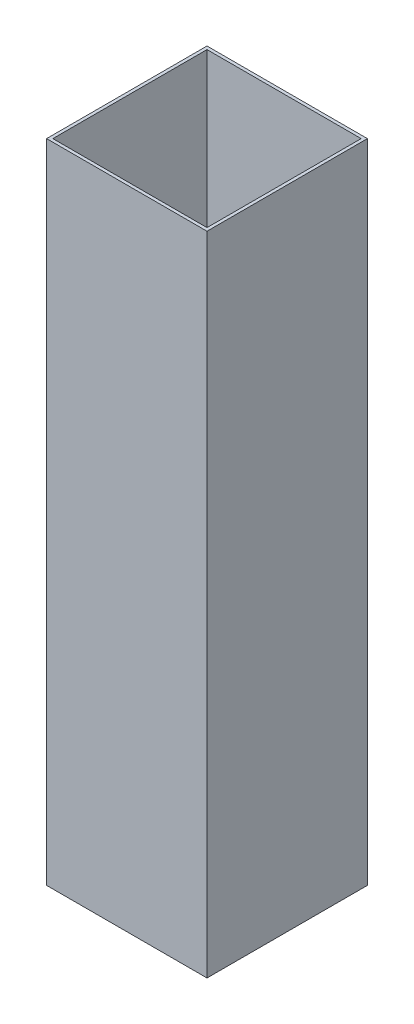
ISO-10303-21;
HEADER;
FILE_DESCRIPTION(('STEP AP214'),'2;1');
FILE_NAME('part.step','',(''),(''),'','','');
FILE_SCHEMA(('AUTOMOTIVE_DESIGN { 1 0 10303 214 1 1 1 1 }'));
ENDSEC;
DATA;
#1=APPLICATION_CONTEXT('core data for automotive mechanical design processes');
#2=APPLICATION_PROTOCOL_DEFINITION('international standard','automotive_design',2000,#1);
#3=PRODUCT_CONTEXT('',#1,'mechanical');
#4=PRODUCT('Part','Part','',(#3));
#5=PRODUCT_RELATED_PRODUCT_CATEGORY('part','',(#4));
#6=PRODUCT_DEFINITION_FORMATION('','',#4);
#7=PRODUCT_DEFINITION_CONTEXT('part definition',#1,'design');
#8=PRODUCT_DEFINITION('design','',#6,#7);
#9=PRODUCT_DEFINITION_SHAPE('','',#8);
#10=(LENGTH_UNIT() NAMED_UNIT(*) SI_UNIT(.MILLI.,.METRE.));
#11=(NAMED_UNIT(*) PLANE_ANGLE_UNIT() SI_UNIT($,.RADIAN.));
#12=(NAMED_UNIT(*) SI_UNIT($,.STERADIAN.) SOLID_ANGLE_UNIT());
#13=UNCERTAINTY_MEASURE_WITH_UNIT(LENGTH_MEASURE(1.E-05),#10,'distance_accuracy_value','');
#14=(GEOMETRIC_REPRESENTATION_CONTEXT(3) GLOBAL_UNCERTAINTY_ASSIGNED_CONTEXT((#13)) GLOBAL_UNIT_ASSIGNED_CONTEXT((#10,
#11,#12)) REPRESENTATION_CONTEXT('',''));
#15=CARTESIAN_POINT('',(0.,0.,0.));
#16=DIRECTION('',(0.,0.,1.));
#17=DIRECTION('',(1.,0.,0.));
#18=AXIS2_PLACEMENT_3D('',#15,#16,#17);
#19=CARTESIAN_POINT('',(-38.0354609929078,250.,-20.9964539007092));
#20=DIRECTION('',(1.,0.,0.));
#21=DIRECTION('',(0.,0.,-1.));
#22=AXIS2_PLACEMENT_3D('',#19,#20,#21);
#23=PLANE('',#22);
#24=DIRECTION('',(0.,0.,1.));
#25=VECTOR('',#24,1.);
#26=CARTESIAN_POINT('',(-38.0354609929078,0.,-20.9964539007092));
#27=LINE('',#26,#25);
#28=CARTESIAN_POINT('',(-38.0354609929078,0.,-20.9964539007092));
#29=VERTEX_POINT('',#28);
#30=CARTESIAN_POINT('',(-38.0354609929078,0.,41.0035460992908));
#31=VERTEX_POINT('',#30);
#32=EDGE_CURVE('E167',#29,#31,#27,.T.);
#33=ORIENTED_EDGE('',*,*,#32,.T.);
#34=DIRECTION('',(0.,-1.,0.));
#35=VECTOR('',#34,1.);
#36=CARTESIAN_POINT('',(-38.0354609929078,250.,41.0035460992908));
#37=LINE('',#36,#35);
#38=CARTESIAN_POINT('',(-38.0354609929078,250.,41.0035460992908));
#39=VERTEX_POINT('',#38);
#40=EDGE_CURVE('E11',#39,#31,#37,.T.);
#41=ORIENTED_EDGE('',*,*,#40,.F.);
#42=DIRECTION('',(0.,0.,1.));
#43=VECTOR('',#42,1.);
#44=CARTESIAN_POINT('',(-38.0354609929078,250.,-20.9964539007092));
#45=LINE('',#44,#43);
#46=CARTESIAN_POINT('',(-38.0354609929078,250.,-20.9964539007092));
#47=VERTEX_POINT('',#46);
#48=EDGE_CURVE('E156',#47,#39,#45,.T.);
#49=ORIENTED_EDGE('',*,*,#48,.F.);
#50=DIRECTION('',(0.,-1.,0.));
#51=VECTOR('',#50,1.);
#52=CARTESIAN_POINT('',(-38.0354609929078,250.,-20.9964539007092));
#53=LINE('',#52,#51);
#54=EDGE_CURVE('E166',#47,#29,#53,.T.);
#55=ORIENTED_EDGE('',*,*,#54,.T.);
#56=EDGE_LOOP('',(#33,#41,#49,#55));
#57=FACE_BOUND('',#56,.T.);
#58=ADVANCED_FACE('F39',(#57),#23,.F.);
#59=CARTESIAN_POINT('',(-38.0354609929078,250.,41.0035460992908));
#60=DIRECTION('',(0.,0.,-1.));
#61=DIRECTION('',(-1.,0.,0.));
#62=AXIS2_PLACEMENT_3D('',#59,#60,#61);
#63=PLANE('',#62);
#64=DIRECTION('',(1.,0.,0.));
#65=VECTOR('',#64,1.);
#66=CARTESIAN_POINT('',(-38.0354609929078,0.,41.0035460992908));
#67=LINE('',#66,#65);
#68=CARTESIAN_POINT('',(23.9645390070922,0.,41.0035460992908));
#69=VERTEX_POINT('',#68);
#70=EDGE_CURVE('E171',#31,#69,#67,.T.);
#71=ORIENTED_EDGE('',*,*,#70,.T.);
#72=DIRECTION('',(0.,-1.,0.));
#73=VECTOR('',#72,1.);
#74=CARTESIAN_POINT('',(23.9645390070922,250.,41.0035460992908));
#75=LINE('',#74,#73);
#76=CARTESIAN_POINT('',(23.9645390070922,250.,41.0035460992908));
#77=VERTEX_POINT('',#76);
#78=EDGE_CURVE('E47',#77,#69,#75,.T.);
#79=ORIENTED_EDGE('',*,*,#78,.F.);
#80=DIRECTION('',(1.,0.,0.));
#81=VECTOR('',#80,1.);
#82=CARTESIAN_POINT('',(-38.0354609929078,250.,41.0035460992908));
#83=LINE('',#82,#81);
#84=EDGE_CURVE('E91',#39,#77,#83,.T.);
#85=ORIENTED_EDGE('',*,*,#84,.F.);
#86=ORIENTED_EDGE('',*,*,#40,.T.);
#87=EDGE_LOOP('',(#71,#79,#85,#86));
#88=FACE_BOUND('',#87,.T.);
#89=ADVANCED_FACE('F206',(#88),#63,.F.);
#90=CARTESIAN_POINT('',(23.9645390070922,250.,-20.9964539007092));
#91=DIRECTION('',(-1.,0.,0.));
#92=DIRECTION('',(0.,0.,1.));
#93=AXIS2_PLACEMENT_3D('',#90,#91,#92);
#94=PLANE('',#93);
#95=DIRECTION('',(0.,0.,-1.));
#96=VECTOR('',#95,1.);
#97=CARTESIAN_POINT('',(23.9645390070922,0.,-20.9964539007092));
#98=LINE('',#97,#96);
#99=CARTESIAN_POINT('',(23.9645390070922,0.,-20.9964539007092));
#100=VERTEX_POINT('',#99);
#101=EDGE_CURVE('E174',#69,#100,#98,.T.);
#102=ORIENTED_EDGE('',*,*,#101,.T.);
#103=DIRECTION('',(0.,-1.,0.));
#104=VECTOR('',#103,1.);
#105=CARTESIAN_POINT('',(23.9645390070922,250.,-20.9964539007092));
#106=LINE('',#105,#104);
#107=CARTESIAN_POINT('',(23.9645390070922,250.,-20.9964539007092));
#108=VERTEX_POINT('',#107);
#109=EDGE_CURVE('E181',#108,#100,#106,.T.);
#110=ORIENTED_EDGE('',*,*,#109,.F.);
#111=DIRECTION('',(0.,0.,-1.));
#112=VECTOR('',#111,1.);
#113=CARTESIAN_POINT('',(23.9645390070922,250.,-20.9964539007092));
#114=LINE('',#113,#112);
#115=EDGE_CURVE('E161',#77,#108,#114,.T.);
#116=ORIENTED_EDGE('',*,*,#115,.F.);
#117=ORIENTED_EDGE('',*,*,#78,.T.);
#118=EDGE_LOOP('',(#102,#110,#116,#117));
#119=FACE_BOUND('',#118,.T.);
#120=ADVANCED_FACE('F188',(#119),#94,.F.);
#121=CARTESIAN_POINT('',(-38.0354609929078,250.,-20.9964539007092));
#122=DIRECTION('',(0.,0.,1.));
#123=DIRECTION('',(1.,0.,0.));
#124=AXIS2_PLACEMENT_3D('',#121,#122,#123);
#125=PLANE('',#124);
#126=DIRECTION('',(-1.,0.,0.));
#127=VECTOR('',#126,1.);
#128=CARTESIAN_POINT('',(-38.0354609929078,0.,-20.9964539007092));
#129=LINE('',#128,#127);
#130=EDGE_CURVE('E84',#100,#29,#129,.T.);
#131=ORIENTED_EDGE('',*,*,#130,.T.);
#132=ORIENTED_EDGE('',*,*,#54,.F.);
#133=DIRECTION('',(-1.,0.,0.));
#134=VECTOR('',#133,1.);
#135=CARTESIAN_POINT('',(-38.0354609929078,250.,-20.9964539007092));
#136=LINE('',#135,#134);
#137=EDGE_CURVE('E63',#108,#47,#136,.T.);
#138=ORIENTED_EDGE('',*,*,#137,.F.);
#139=ORIENTED_EDGE('',*,*,#109,.T.);
#140=EDGE_LOOP('',(#131,#132,#138,#139));
#141=FACE_BOUND('',#140,.T.);
#142=ADVANCED_FACE('F196',(#141),#125,.F.);
#143=CARTESIAN_POINT('',(0.,250.,0.));
#144=DIRECTION('',(0.,1.,0.));
#145=DIRECTION('',(0.,0.,1.));
#146=AXIS2_PLACEMENT_3D('',#143,#144,#145);
#147=PLANE('',#146);
#148=DIRECTION('',(0.,0.,1.));
#149=VECTOR('',#148,1.);
#150=CARTESIAN_POINT('',(-36.8354609929078,250.,-20.9964539007092));
#151=LINE('',#150,#149);
#152=CARTESIAN_POINT('',(-36.8354609929078,250.,-19.7964539007092));
#153=VERTEX_POINT('',#152);
#154=CARTESIAN_POINT('',(-36.8354609929078,250.,39.8035460992908));
#155=VERTEX_POINT('',#154);
#156=EDGE_CURVE('E140',#153,#155,#151,.T.);
#157=ORIENTED_EDGE('',*,*,#156,.F.);
#158=DIRECTION('',(-1.,0.,0.));
#159=VECTOR('',#158,1.);
#160=CARTESIAN_POINT('',(-38.0354609929078,250.,-19.7964539007092));
#161=LINE('',#160,#159);
#162=CARTESIAN_POINT('',(22.7645390070922,250.,-19.7964539007092));
#163=VERTEX_POINT('',#162);
#164=EDGE_CURVE('E153',#163,#153,#161,.T.);
#165=ORIENTED_EDGE('',*,*,#164,.F.);
#166=DIRECTION('',(0.,0.,-1.));
#167=VECTOR('',#166,1.);
#168=CARTESIAN_POINT('',(22.7645390070922,250.,-20.9964539007092));
#169=LINE('',#168,#167);
#170=CARTESIAN_POINT('',(22.7645390070922,250.,39.8035460992908));
#171=VERTEX_POINT('',#170);
#172=EDGE_CURVE('E150',#171,#163,#169,.T.);
#173=ORIENTED_EDGE('',*,*,#172,.F.);
#174=DIRECTION('',(1.,0.,0.));
#175=VECTOR('',#174,1.);
#176=CARTESIAN_POINT('',(-38.0354609929078,250.,39.8035460992908));
#177=LINE('',#176,#175);
#178=EDGE_CURVE('E129',#155,#171,#177,.T.);
#179=ORIENTED_EDGE('',*,*,#178,.F.);
#180=EDGE_LOOP('',(#157,#165,#173,#179));
#181=FACE_BOUND('',#180,.T.);
#182=ORIENTED_EDGE('',*,*,#48,.T.);
#183=ORIENTED_EDGE('',*,*,#84,.T.);
#184=ORIENTED_EDGE('',*,*,#115,.T.);
#185=ORIENTED_EDGE('',*,*,#137,.T.);
#186=EDGE_LOOP('',(#182,#183,#184,#185));
#187=FACE_BOUND('',#186,.T.);
#188=ADVANCED_FACE('F198',(#181,#187),#147,.T.);
#189=CARTESIAN_POINT('',(0.,0.,0.));
#190=DIRECTION('',(0.,1.,0.));
#191=DIRECTION('',(0.,0.,1.));
#192=AXIS2_PLACEMENT_3D('',#189,#190,#191);
#193=PLANE('',#192);
#194=ORIENTED_EDGE('',*,*,#32,.F.);
#195=ORIENTED_EDGE('',*,*,#130,.F.);
#196=ORIENTED_EDGE('',*,*,#101,.F.);
#197=ORIENTED_EDGE('',*,*,#70,.F.);
#198=EDGE_LOOP('',(#194,#195,#196,#197));
#199=FACE_BOUND('',#198,.T.);
#200=ADVANCED_FACE('F192',(#199),#193,.F.);
#201=CARTESIAN_POINT('',(-36.8354609929078,250.,-20.9964539007092));
#202=DIRECTION('',(1.,0.,0.));
#203=DIRECTION('',(0.,0.,-1.));
#204=AXIS2_PLACEMENT_3D('',#201,#202,#203);
#205=PLANE('',#204);
#206=DIRECTION('',(0.,0.,1.));
#207=VECTOR('',#206,1.);
#208=CARTESIAN_POINT('',(-36.8354609929078,1.20000000000001,-20.9964539007092));
#209=LINE('',#208,#207);
#210=CARTESIAN_POINT('',(-36.8354609929078,1.2,-19.7964539007092));
#211=VERTEX_POINT('',#210);
#212=CARTESIAN_POINT('',(-36.8354609929078,1.2,39.8035460992908));
#213=VERTEX_POINT('',#212);
#214=EDGE_CURVE('E119',#211,#213,#209,.T.);
#215=ORIENTED_EDGE('',*,*,#214,.F.);
#216=DIRECTION('',(0.,-1.,0.));
#217=VECTOR('',#216,1.);
#218=CARTESIAN_POINT('',(-36.8354609929078,250.,-19.7964539007092));
#219=LINE('',#218,#217);
#220=EDGE_CURVE('E144',#153,#211,#219,.T.);
#221=ORIENTED_EDGE('',*,*,#220,.F.);
#222=ORIENTED_EDGE('',*,*,#156,.T.);
#223=DIRECTION('',(0.,-1.,0.));
#224=VECTOR('',#223,1.);
#225=CARTESIAN_POINT('',(-36.8354609929078,250.,39.8035460992908));
#226=LINE('',#225,#224);
#227=EDGE_CURVE('E133',#155,#213,#226,.T.);
#228=ORIENTED_EDGE('',*,*,#227,.T.);
#229=EDGE_LOOP('',(#215,#221,#222,#228));
#230=FACE_BOUND('',#229,.T.);
#231=ADVANCED_FACE('F233',(#230),#205,.T.);
#232=CARTESIAN_POINT('',(-38.0354609929078,250.,39.8035460992908));
#233=DIRECTION('',(0.,0.,-1.));
#234=DIRECTION('',(-1.,0.,0.));
#235=AXIS2_PLACEMENT_3D('',#232,#233,#234);
#236=PLANE('',#235);
#237=DIRECTION('',(1.,0.,0.));
#238=VECTOR('',#237,1.);
#239=CARTESIAN_POINT('',(-38.0354609929078,1.20000000000001,39.8035460992908));
#240=LINE('',#239,#238);
#241=CARTESIAN_POINT('',(22.7645390070922,1.2,39.8035460992908));
#242=VERTEX_POINT('',#241);
#243=EDGE_CURVE('E113',#213,#242,#240,.T.);
#244=ORIENTED_EDGE('',*,*,#243,.F.);
#245=ORIENTED_EDGE('',*,*,#227,.F.);
#246=ORIENTED_EDGE('',*,*,#178,.T.);
#247=DIRECTION('',(0.,-1.,0.));
#248=VECTOR('',#247,1.);
#249=CARTESIAN_POINT('',(22.7645390070922,250.,39.8035460992908));
#250=LINE('',#249,#248);
#251=EDGE_CURVE('E126',#171,#242,#250,.T.);
#252=ORIENTED_EDGE('',*,*,#251,.T.);
#253=EDGE_LOOP('',(#244,#245,#246,#252));
#254=FACE_BOUND('',#253,.T.);
#255=ADVANCED_FACE('F127',(#254),#236,.T.);
#256=CARTESIAN_POINT('',(22.7645390070922,250.,-20.9964539007092));
#257=DIRECTION('',(-1.,0.,0.));
#258=DIRECTION('',(0.,0.,1.));
#259=AXIS2_PLACEMENT_3D('',#256,#257,#258);
#260=PLANE('',#259);
#261=DIRECTION('',(0.,0.,-1.));
#262=VECTOR('',#261,1.);
#263=CARTESIAN_POINT('',(22.7645390070922,1.20000000000001,-20.9964539007092));
#264=LINE('',#263,#262);
#265=CARTESIAN_POINT('',(22.7645390070922,1.2,-19.7964539007092));
#266=VERTEX_POINT('',#265);
#267=EDGE_CURVE('E117',#242,#266,#264,.T.);
#268=ORIENTED_EDGE('',*,*,#267,.F.);
#269=ORIENTED_EDGE('',*,*,#251,.F.);
#270=ORIENTED_EDGE('',*,*,#172,.T.);
#271=DIRECTION('',(0.,-1.,0.));
#272=VECTOR('',#271,1.);
#273=CARTESIAN_POINT('',(22.7645390070922,250.,-19.7964539007092));
#274=LINE('',#273,#272);
#275=EDGE_CURVE('E54',#163,#266,#274,.T.);
#276=ORIENTED_EDGE('',*,*,#275,.T.);
#277=EDGE_LOOP('',(#268,#269,#270,#276));
#278=FACE_BOUND('',#277,.T.);
#279=ADVANCED_FACE('F135',(#278),#260,.T.);
#280=CARTESIAN_POINT('',(-38.0354609929078,250.,-19.7964539007092));
#281=DIRECTION('',(0.,0.,1.));
#282=DIRECTION('',(1.,0.,0.));
#283=AXIS2_PLACEMENT_3D('',#280,#281,#282);
#284=PLANE('',#283);
#285=DIRECTION('',(-1.,0.,0.));
#286=VECTOR('',#285,1.);
#287=CARTESIAN_POINT('',(-38.0354609929078,1.20000000000001,-19.7964539007092));
#288=LINE('',#287,#286);
#289=EDGE_CURVE('E137',#266,#211,#288,.T.);
#290=ORIENTED_EDGE('',*,*,#289,.F.);
#291=ORIENTED_EDGE('',*,*,#275,.F.);
#292=ORIENTED_EDGE('',*,*,#164,.T.);
#293=ORIENTED_EDGE('',*,*,#220,.T.);
#294=EDGE_LOOP('',(#290,#291,#292,#293));
#295=FACE_BOUND('',#294,.T.);
#296=ADVANCED_FACE('F263',(#295),#284,.T.);
#297=CARTESIAN_POINT('',(0.,1.2,0.));
#298=DIRECTION('',(0.,1.,0.));
#299=DIRECTION('',(0.,0.,1.));
#300=AXIS2_PLACEMENT_3D('',#297,#298,#299);
#301=PLANE('',#300);
#302=ORIENTED_EDGE('',*,*,#214,.T.);
#303=ORIENTED_EDGE('',*,*,#243,.T.);
#304=ORIENTED_EDGE('',*,*,#267,.T.);
#305=ORIENTED_EDGE('',*,*,#289,.T.);
#306=EDGE_LOOP('',(#302,#303,#304,#305));
#307=FACE_BOUND('',#306,.T.);
#308=ADVANCED_FACE('F115',(#307),#301,.T.);
#309=CLOSED_SHELL('',(#58,#89,#120,#142,#188,#200,#231,#255,#279,#296,#308));
#310=MANIFOLD_SOLID_BREP('B2',#309);
#311=ADVANCED_BREP_SHAPE_REPRESENTATION('',(#18,#310),#14);
#312=SHAPE_DEFINITION_REPRESENTATION(#9,#311);
ENDSEC;
END-ISO-10303-21;
